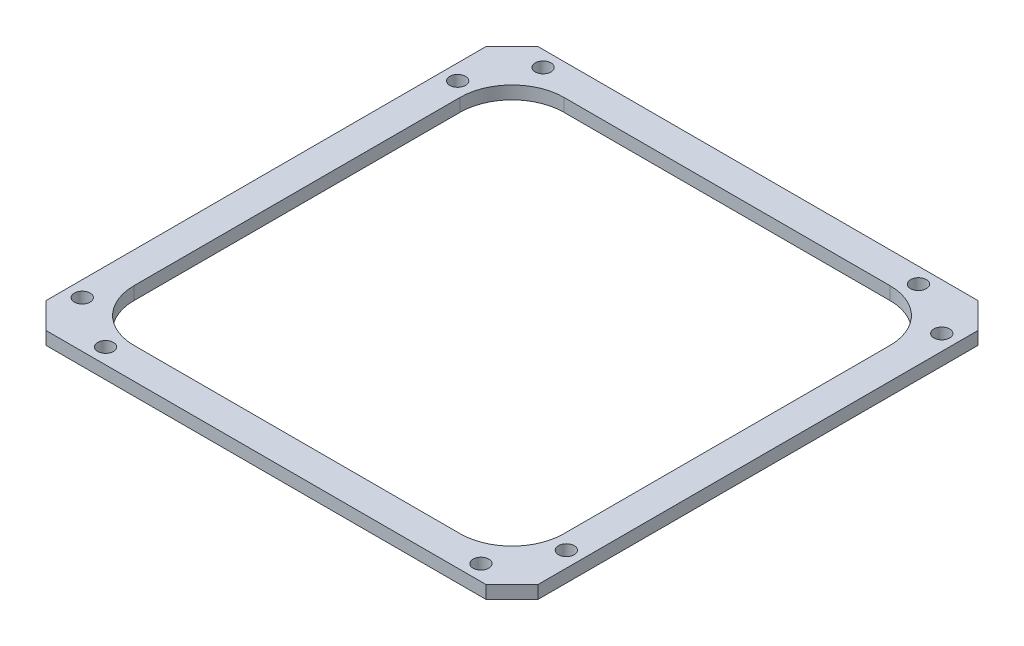
ISO-10303-21;
HEADER;
FILE_DESCRIPTION(('STEP AP214'),'2;1');
FILE_NAME('part.step','',(''),(''),'','','');
FILE_SCHEMA(('AUTOMOTIVE_DESIGN { 1 0 10303 214 1 1 1 1 }'));
ENDSEC;
DATA;
#1=APPLICATION_CONTEXT('core data for automotive mechanical design processes');
#2=APPLICATION_PROTOCOL_DEFINITION('international standard','automotive_design',2000,#1);
#3=PRODUCT_CONTEXT('',#1,'mechanical');
#4=PRODUCT('Part','Part','',(#3));
#5=PRODUCT_RELATED_PRODUCT_CATEGORY('part','',(#4));
#6=PRODUCT_DEFINITION_FORMATION('','',#4);
#7=PRODUCT_DEFINITION_CONTEXT('part definition',#1,'design');
#8=PRODUCT_DEFINITION('design','',#6,#7);
#9=PRODUCT_DEFINITION_SHAPE('','',#8);
#10=(LENGTH_UNIT() NAMED_UNIT(*) SI_UNIT(.MILLI.,.METRE.));
#11=(NAMED_UNIT(*) PLANE_ANGLE_UNIT() SI_UNIT($,.RADIAN.));
#12=(NAMED_UNIT(*) SI_UNIT($,.STERADIAN.) SOLID_ANGLE_UNIT());
#13=UNCERTAINTY_MEASURE_WITH_UNIT(LENGTH_MEASURE(1.E-05),#10,'distance_accuracy_value','');
#14=(GEOMETRIC_REPRESENTATION_CONTEXT(3) GLOBAL_UNCERTAINTY_ASSIGNED_CONTEXT((#13)) GLOBAL_UNIT_ASSIGNED_CONTEXT((#10,
#11,#12)) REPRESENTATION_CONTEXT('',''));
#15=CARTESIAN_POINT('',(0.,0.,0.));
#16=DIRECTION('',(0.,0.,1.));
#17=DIRECTION('',(1.,0.,0.));
#18=AXIS2_PLACEMENT_3D('',#15,#16,#17);
#19=CARTESIAN_POINT('',(-95.,5.,-95.));
#20=DIRECTION('',(0.,0.,-1.));
#21=DIRECTION('',(-1.,0.,0.));
#22=AXIS2_PLACEMENT_3D('',#19,#20,#21);
#23=PLANE('',#22);
#24=DIRECTION('',(1.,0.,0.));
#25=VECTOR('',#24,1.);
#26=CARTESIAN_POINT('',(-95.,5.,-95.));
#27=LINE('',#26,#25);
#28=CARTESIAN_POINT('',(-85.,5.,-95.));
#29=VERTEX_POINT('',#28);
#30=CARTESIAN_POINT('',(85.,5.,-95.));
#31=VERTEX_POINT('',#30);
#32=EDGE_CURVE('E193',#29,#31,#27,.T.);
#33=ORIENTED_EDGE('',*,*,#32,.T.);
#34=DIRECTION('',(0.,-1.,0.));
#35=VECTOR('',#34,1.);
#36=CARTESIAN_POINT('',(85.,5.,-95.));
#37=LINE('',#36,#35);
#38=CARTESIAN_POINT('',(85.,0.,-95.));
#39=VERTEX_POINT('',#38);
#40=EDGE_CURVE('E241',#31,#39,#37,.T.);
#41=ORIENTED_EDGE('',*,*,#40,.T.);
#42=DIRECTION('',(1.,0.,0.));
#43=VECTOR('',#42,1.);
#44=CARTESIAN_POINT('',(-95.,0.,-95.));
#45=LINE('',#44,#43);
#46=CARTESIAN_POINT('',(-85.,0.,-95.));
#47=VERTEX_POINT('',#46);
#48=EDGE_CURVE('E204',#47,#39,#45,.T.);
#49=ORIENTED_EDGE('',*,*,#48,.F.);
#50=DIRECTION('',(0.,1.,0.));
#51=VECTOR('',#50,1.);
#52=CARTESIAN_POINT('',(-85.,5.,-95.));
#53=LINE('',#52,#51);
#54=EDGE_CURVE('E239',#47,#29,#53,.T.);
#55=ORIENTED_EDGE('',*,*,#54,.T.);
#56=EDGE_LOOP('',(#33,#41,#49,#55));
#57=FACE_BOUND('',#56,.T.);
#58=ADVANCED_FACE('F35',(#57),#23,.T.);
#59=CARTESIAN_POINT('',(-95.,5.,-95.));
#60=DIRECTION('',(1.,0.,0.));
#61=DIRECTION('',(0.,0.,-1.));
#62=AXIS2_PLACEMENT_3D('',#59,#60,#61);
#63=PLANE('',#62);
#64=DIRECTION('',(0.,0.,1.));
#65=VECTOR('',#64,1.);
#66=CARTESIAN_POINT('',(-95.,5.,-95.));
#67=LINE('',#66,#65);
#68=CARTESIAN_POINT('',(-95.,5.,-85.));
#69=VERTEX_POINT('',#68);
#70=CARTESIAN_POINT('',(-95.,5.,85.));
#71=VERTEX_POINT('',#70);
#72=EDGE_CURVE('E202',#69,#71,#67,.T.);
#73=ORIENTED_EDGE('',*,*,#72,.F.);
#74=DIRECTION('',(0.,-1.,0.));
#75=VECTOR('',#74,1.);
#76=CARTESIAN_POINT('',(-95.,0.,-85.));
#77=LINE('',#76,#75);
#78=CARTESIAN_POINT('',(-95.,0.,-85.));
#79=VERTEX_POINT('',#78);
#80=EDGE_CURVE('E266',#69,#79,#77,.T.);
#81=ORIENTED_EDGE('',*,*,#80,.T.);
#82=DIRECTION('',(0.,0.,1.));
#83=VECTOR('',#82,1.);
#84=CARTESIAN_POINT('',(-95.,0.,-95.));
#85=LINE('',#84,#83);
#86=CARTESIAN_POINT('',(-95.,0.,85.));
#87=VERTEX_POINT('',#86);
#88=EDGE_CURVE('E197',#79,#87,#85,.T.);
#89=ORIENTED_EDGE('',*,*,#88,.T.);
#90=DIRECTION('',(0.,1.,0.));
#91=VECTOR('',#90,1.);
#92=CARTESIAN_POINT('',(-95.,5.,85.));
#93=LINE('',#92,#91);
#94=EDGE_CURVE('E264',#87,#71,#93,.T.);
#95=ORIENTED_EDGE('',*,*,#94,.T.);
#96=EDGE_LOOP('',(#73,#81,#89,#95));
#97=FACE_BOUND('',#96,.T.);
#98=ADVANCED_FACE('F272',(#97),#63,.F.);
#99=CARTESIAN_POINT('',(-95.,5.,95.));
#100=DIRECTION('',(0.,0.,-1.));
#101=DIRECTION('',(-1.,0.,0.));
#102=AXIS2_PLACEMENT_3D('',#99,#100,#101);
#103=PLANE('',#102);
#104=DIRECTION('',(1.,0.,0.));
#105=VECTOR('',#104,1.);
#106=CARTESIAN_POINT('',(-95.,5.,95.));
#107=LINE('',#106,#105);
#108=CARTESIAN_POINT('',(-85.,5.,95.));
#109=VERTEX_POINT('',#108);
#110=CARTESIAN_POINT('',(85.,5.,95.));
#111=VERTEX_POINT('',#110);
#112=EDGE_CURVE('E200',#109,#111,#107,.T.);
#113=ORIENTED_EDGE('',*,*,#112,.F.);
#114=DIRECTION('',(0.,-1.,0.));
#115=VECTOR('',#114,1.);
#116=CARTESIAN_POINT('',(-85.,5.,95.));
#117=LINE('',#116,#115);
#118=CARTESIAN_POINT('',(-85.,0.,95.));
#119=VERTEX_POINT('',#118);
#120=EDGE_CURVE('E11',#109,#119,#117,.T.);
#121=ORIENTED_EDGE('',*,*,#120,.T.);
#122=DIRECTION('',(1.,0.,0.));
#123=VECTOR('',#122,1.);
#124=CARTESIAN_POINT('',(-95.,0.,95.));
#125=LINE('',#124,#123);
#126=CARTESIAN_POINT('',(85.,0.,95.));
#127=VERTEX_POINT('',#126);
#128=EDGE_CURVE('E210',#119,#127,#125,.T.);
#129=ORIENTED_EDGE('',*,*,#128,.T.);
#130=DIRECTION('',(0.,1.,0.));
#131=VECTOR('',#130,1.);
#132=CARTESIAN_POINT('',(85.,5.,95.));
#133=LINE('',#132,#131);
#134=EDGE_CURVE('E43',#127,#111,#133,.T.);
#135=ORIENTED_EDGE('',*,*,#134,.T.);
#136=EDGE_LOOP('',(#113,#121,#129,#135));
#137=FACE_BOUND('',#136,.T.);
#138=ADVANCED_FACE('F283',(#137),#103,.F.);
#139=CARTESIAN_POINT('',(95.,5.,-95.));
#140=DIRECTION('',(1.,0.,0.));
#141=DIRECTION('',(0.,0.,-1.));
#142=AXIS2_PLACEMENT_3D('',#139,#140,#141);
#143=PLANE('',#142);
#144=DIRECTION('',(0.,0.,1.));
#145=VECTOR('',#144,1.);
#146=CARTESIAN_POINT('',(95.,0.,-95.));
#147=LINE('',#146,#145);
#148=CARTESIAN_POINT('',(95.,0.,-85.));
#149=VERTEX_POINT('',#148);
#150=CARTESIAN_POINT('',(95.,0.,85.));
#151=VERTEX_POINT('',#150);
#152=EDGE_CURVE('E207',#149,#151,#147,.T.);
#153=ORIENTED_EDGE('',*,*,#152,.F.);
#154=DIRECTION('',(0.,1.,0.));
#155=VECTOR('',#154,1.);
#156=CARTESIAN_POINT('',(95.,5.,-85.));
#157=LINE('',#156,#155);
#158=CARTESIAN_POINT('',(95.,5.,-85.));
#159=VERTEX_POINT('',#158);
#160=EDGE_CURVE('E255',#149,#159,#157,.T.);
#161=ORIENTED_EDGE('',*,*,#160,.T.);
#162=DIRECTION('',(0.,0.,1.));
#163=VECTOR('',#162,1.);
#164=CARTESIAN_POINT('',(95.,5.,-95.));
#165=LINE('',#164,#163);
#166=CARTESIAN_POINT('',(95.,5.,85.));
#167=VERTEX_POINT('',#166);
#168=EDGE_CURVE('E196',#159,#167,#165,.T.);
#169=ORIENTED_EDGE('',*,*,#168,.T.);
#170=DIRECTION('',(0.,-1.,0.));
#171=VECTOR('',#170,1.);
#172=CARTESIAN_POINT('',(95.,0.,85.));
#173=LINE('',#172,#171);
#174=EDGE_CURVE('E252',#167,#151,#173,.T.);
#175=ORIENTED_EDGE('',*,*,#174,.T.);
#176=EDGE_LOOP('',(#153,#161,#169,#175));
#177=FACE_BOUND('',#176,.T.);
#178=ADVANCED_FACE('F290',(#177),#143,.T.);
#179=CARTESIAN_POINT('',(0.,5.,0.));
#180=DIRECTION('',(0.,-1.,0.));
#181=DIRECTION('',(0.,0.,-1.));
#182=AXIS2_PLACEMENT_3D('',#179,#180,#181);
#183=PLANE('',#182);
#184=CARTESIAN_POINT('',(77.0000000000146,5.,88.9999999999822));
#185=DIRECTION('',(0.,1.,0.));
#186=DIRECTION('',(0.,0.,1.));
#187=AXIS2_PLACEMENT_3D('',#184,#185,#186);
#188=CIRCLE('',#187,3.04999999999999);
#189=CARTESIAN_POINT('',(77.0000000000146,5.,92.0499999999822));
#190=VERTEX_POINT('',#189);
#191=EDGE_CURVE('E368',#190,#190,#188,.T.);
#192=ORIENTED_EDGE('',*,*,#191,.F.);
#193=EDGE_LOOP('',(#192));
#194=FACE_BOUND('',#193,.T.);
#195=CARTESIAN_POINT('',(67.9999999999984,5.,-89.0000000000162));
#196=DIRECTION('',(0.,1.,0.));
#197=DIRECTION('',(0.,0.,1.));
#198=AXIS2_PLACEMENT_3D('',#195,#196,#197);
#199=CIRCLE('',#198,3.04999999999999);
#200=CARTESIAN_POINT('',(67.9999999999984,5.,-85.9500000000162));
#201=VERTEX_POINT('',#200);
#202=EDGE_CURVE('E375',#201,#201,#199,.T.);
#203=ORIENTED_EDGE('',*,*,#202,.F.);
#204=EDGE_LOOP('',(#203));
#205=FACE_BOUND('',#204,.T.);
#206=CARTESIAN_POINT('',(88.9999999999984,5.,-77.0000000000162));
#207=DIRECTION('',(0.,1.,0.));
#208=DIRECTION('',(0.,0.,1.));
#209=AXIS2_PLACEMENT_3D('',#206,#207,#208);
#210=CIRCLE('',#209,3.04999999999999);
#211=CARTESIAN_POINT('',(88.9999999999984,5.,-73.9500000000162));
#212=VERTEX_POINT('',#211);
#213=EDGE_CURVE('E356',#212,#212,#210,.T.);
#214=ORIENTED_EDGE('',*,*,#213,.F.);
#215=EDGE_LOOP('',(#214));
#216=FACE_BOUND('',#215,.T.);
#217=CARTESIAN_POINT('',(-89.,5.,-68.));
#218=DIRECTION('',(0.,1.,0.));
#219=DIRECTION('',(0.,0.,1.));
#220=AXIS2_PLACEMENT_3D('',#217,#218,#219);
#221=CIRCLE('',#220,3.04999999999999);
#222=CARTESIAN_POINT('',(-89.,5.,-64.95));
#223=VERTEX_POINT('',#222);
#224=EDGE_CURVE('E363',#223,#223,#221,.T.);
#225=ORIENTED_EDGE('',*,*,#224,.F.);
#226=EDGE_LOOP('',(#225));
#227=FACE_BOUND('',#226,.T.);
#228=CARTESIAN_POINT('',(89.0000000000146,5.,67.9999999999822));
#229=DIRECTION('',(0.,1.,0.));
#230=DIRECTION('',(0.,0.,1.));
#231=AXIS2_PLACEMENT_3D('',#228,#229,#230);
#232=CIRCLE('',#231,3.04999999999999);
#233=CARTESIAN_POINT('',(89.0000000000146,5.,71.0499999999822));
#234=VERTEX_POINT('',#233);
#235=EDGE_CURVE('E392',#234,#234,#232,.T.);
#236=ORIENTED_EDGE('',*,*,#235,.F.);
#237=EDGE_LOOP('',(#236));
#238=FACE_BOUND('',#237,.T.);
#239=CARTESIAN_POINT('',(-88.9999999999838,5.,76.9999999999984));
#240=DIRECTION('',(0.,1.,0.));
#241=DIRECTION('',(0.,0.,1.));
#242=AXIS2_PLACEMENT_3D('',#239,#240,#241);
#243=CIRCLE('',#242,3.04999999999999);
#244=CARTESIAN_POINT('',(-88.9999999999838,5.,80.0499999999984));
#245=VERTEX_POINT('',#244);
#246=EDGE_CURVE('E386',#245,#245,#243,.T.);
#247=ORIENTED_EDGE('',*,*,#246,.F.);
#248=EDGE_LOOP('',(#247));
#249=FACE_BOUND('',#248,.T.);
#250=CARTESIAN_POINT('',(-67.9999999999838,5.,88.9999999999984));
#251=DIRECTION('',(0.,1.,0.));
#252=DIRECTION('',(0.,0.,1.));
#253=AXIS2_PLACEMENT_3D('',#250,#251,#252);
#254=CIRCLE('',#253,3.04999999999999);
#255=CARTESIAN_POINT('',(-67.9999999999838,5.,92.0499999999984));
#256=VERTEX_POINT('',#255);
#257=EDGE_CURVE('E380',#256,#256,#254,.T.);
#258=ORIENTED_EDGE('',*,*,#257,.F.);
#259=EDGE_LOOP('',(#258));
#260=FACE_BOUND('',#259,.T.);
#261=CARTESIAN_POINT('',(-77.,5.,-89.));
#262=DIRECTION('',(0.,1.,0.));
#263=DIRECTION('',(0.,0.,1.));
#264=AXIS2_PLACEMENT_3D('',#261,#262,#263);
#265=CIRCLE('',#264,3.04999999999999);
#266=CARTESIAN_POINT('',(-77.,5.,-85.95));
#267=VERTEX_POINT('',#266);
#268=EDGE_CURVE('E183',#267,#267,#265,.T.);
#269=ORIENTED_EDGE('',*,*,#268,.F.);
#270=EDGE_LOOP('',(#269));
#271=FACE_BOUND('',#270,.T.);
#272=DIRECTION('',(-1.,0.,0.));
#273=VECTOR('',#272,1.);
#274=CARTESIAN_POINT('',(-83.,5.,-83.));
#275=LINE('',#274,#273);
#276=CARTESIAN_POINT('',(62.9999999999999,5.,-83.));
#277=VERTEX_POINT('',#276);
#278=CARTESIAN_POINT('',(-63.,5.,-83.));
#279=VERTEX_POINT('',#278);
#280=EDGE_CURVE('E176',#277,#279,#275,.T.);
#281=ORIENTED_EDGE('',*,*,#280,.F.);
#282=CARTESIAN_POINT('',(63.,5.,-63.));
#283=DIRECTION('',(0.,-1.,0.));
#284=DIRECTION('',(0.,0.,-1.));
#285=AXIS2_PLACEMENT_3D('',#282,#283,#284);
#286=CIRCLE('',#285,20.);
#287=CARTESIAN_POINT('',(83.,5.,-63.));
#288=VERTEX_POINT('',#287);
#289=EDGE_CURVE('E175',#277,#288,#286,.T.);
#290=ORIENTED_EDGE('',*,*,#289,.T.);
#291=DIRECTION('',(0.,0.,-1.));
#292=VECTOR('',#291,1.);
#293=CARTESIAN_POINT('',(83.,5.,-83.));
#294=LINE('',#293,#292);
#295=CARTESIAN_POINT('',(83.,5.,63.));
#296=VERTEX_POINT('',#295);
#297=EDGE_CURVE('E166',#296,#288,#294,.T.);
#298=ORIENTED_EDGE('',*,*,#297,.F.);
#299=CARTESIAN_POINT('',(63.,5.,63.));
#300=DIRECTION('',(0.,-1.,0.));
#301=DIRECTION('',(0.,0.,-1.));
#302=AXIS2_PLACEMENT_3D('',#299,#300,#301);
#303=CIRCLE('',#302,20.);
#304=CARTESIAN_POINT('',(62.9999999999999,5.,83.));
#305=VERTEX_POINT('',#304);
#306=EDGE_CURVE('E149',#296,#305,#303,.T.);
#307=ORIENTED_EDGE('',*,*,#306,.T.);
#308=DIRECTION('',(1.,0.,0.));
#309=VECTOR('',#308,1.);
#310=CARTESIAN_POINT('',(-83.,5.,83.));
#311=LINE('',#310,#309);
#312=CARTESIAN_POINT('',(-63.,5.,83.));
#313=VERTEX_POINT('',#312);
#314=EDGE_CURVE('E191',#313,#305,#311,.T.);
#315=ORIENTED_EDGE('',*,*,#314,.F.);
#316=CARTESIAN_POINT('',(-63.,5.,63.));
#317=DIRECTION('',(0.,-1.,0.));
#318=DIRECTION('',(0.,0.,-1.));
#319=AXIS2_PLACEMENT_3D('',#316,#317,#318);
#320=CIRCLE('',#319,20.);
#321=CARTESIAN_POINT('',(-83.,5.,63.));
#322=VERTEX_POINT('',#321);
#323=EDGE_CURVE('E228',#313,#322,#320,.T.);
#324=ORIENTED_EDGE('',*,*,#323,.T.);
#325=DIRECTION('',(0.,0.,1.));
#326=VECTOR('',#325,1.);
#327=CARTESIAN_POINT('',(-83.,5.,-83.));
#328=LINE('',#327,#326);
#329=CARTESIAN_POINT('',(-83.,5.,-63.));
#330=VERTEX_POINT('',#329);
#331=EDGE_CURVE('E180',#330,#322,#328,.T.);
#332=ORIENTED_EDGE('',*,*,#331,.F.);
#333=CARTESIAN_POINT('',(-63.,5.,-63.));
#334=DIRECTION('',(0.,-1.,0.));
#335=DIRECTION('',(0.,0.,-1.));
#336=AXIS2_PLACEMENT_3D('',#333,#334,#335);
#337=CIRCLE('',#336,20.);
#338=EDGE_CURVE('E232',#330,#279,#337,.T.);
#339=ORIENTED_EDGE('',*,*,#338,.T.);
#340=EDGE_LOOP('',(#281,#290,#298,#307,#315,#324,#332,#339));
#341=FACE_BOUND('',#340,.T.);
#342=ORIENTED_EDGE('',*,*,#168,.F.);
#343=DIRECTION('',(0.707106781186548,0.,0.707106781186548));
#344=VECTOR('',#343,1.);
#345=CARTESIAN_POINT('',(85.,5.,-95.));
#346=LINE('',#345,#344);
#347=EDGE_CURVE('E262',#159,#31,#346,.F.);
#348=ORIENTED_EDGE('',*,*,#347,.T.);
#349=ORIENTED_EDGE('',*,*,#32,.F.);
#350=DIRECTION('',(-0.70710678118655,0.,0.707106781186546));
#351=VECTOR('',#350,1.);
#352=CARTESIAN_POINT('',(-95.,5.,-85.));
#353=LINE('',#352,#351);
#354=EDGE_CURVE('E260',#29,#69,#353,.T.);
#355=ORIENTED_EDGE('',*,*,#354,.T.);
#356=ORIENTED_EDGE('',*,*,#72,.T.);
#357=DIRECTION('',(-0.707106781186548,0.,-0.707106781186548));
#358=VECTOR('',#357,1.);
#359=CARTESIAN_POINT('',(-85.,5.,95.));
#360=LINE('',#359,#358);
#361=EDGE_CURVE('E56',#71,#109,#360,.F.);
#362=ORIENTED_EDGE('',*,*,#361,.T.);
#363=ORIENTED_EDGE('',*,*,#112,.T.);
#364=DIRECTION('',(0.70710678118655,0.,-0.707106781186545));
#365=VECTOR('',#364,1.);
#366=CARTESIAN_POINT('',(95.,5.,85.));
#367=LINE('',#366,#365);
#368=EDGE_CURVE('E257',#111,#167,#367,.T.);
#369=ORIENTED_EDGE('',*,*,#368,.T.);
#370=EDGE_LOOP('',(#342,#348,#349,#355,#356,#362,#363,#369));
#371=FACE_BOUND('',#370,.T.);
#372=ADVANCED_FACE('F174',(#194,#205,#216,#227,#238,#249,#260,#271,#341,#371),#183,.F.);
#373=CARTESIAN_POINT('',(0.,0.,0.));
#374=DIRECTION('',(0.,-1.,0.));
#375=DIRECTION('',(0.,0.,-1.));
#376=AXIS2_PLACEMENT_3D('',#373,#374,#375);
#377=PLANE('',#376);
#378=CARTESIAN_POINT('',(77.0000000000146,0.,88.9999999999822));
#379=DIRECTION('',(0.,1.,0.));
#380=DIRECTION('',(0.,0.,1.));
#381=AXIS2_PLACEMENT_3D('',#378,#379,#380);
#382=CIRCLE('',#381,3.04999999999999);
#383=CARTESIAN_POINT('',(77.0000000000146,0.,92.0499999999822));
#384=VERTEX_POINT('',#383);
#385=EDGE_CURVE('E371',#384,#384,#382,.T.);
#386=ORIENTED_EDGE('',*,*,#385,.T.);
#387=EDGE_LOOP('',(#386));
#388=FACE_BOUND('',#387,.T.);
#389=CARTESIAN_POINT('',(67.9999999999984,0.,-89.0000000000162));
#390=DIRECTION('',(0.,1.,0.));
#391=DIRECTION('',(0.,0.,1.));
#392=AXIS2_PLACEMENT_3D('',#389,#390,#391);
#393=CIRCLE('',#392,3.04999999999999);
#394=CARTESIAN_POINT('',(67.9999999999984,0.,-85.9500000000162));
#395=VERTEX_POINT('',#394);
#396=EDGE_CURVE('E360',#395,#395,#393,.T.);
#397=ORIENTED_EDGE('',*,*,#396,.T.);
#398=EDGE_LOOP('',(#397));
#399=FACE_BOUND('',#398,.T.);
#400=CARTESIAN_POINT('',(88.9999999999984,0.,-77.0000000000162));
#401=DIRECTION('',(0.,1.,0.));
#402=DIRECTION('',(0.,0.,1.));
#403=AXIS2_PLACEMENT_3D('',#400,#401,#402);
#404=CIRCLE('',#403,3.04999999999999);
#405=CARTESIAN_POINT('',(88.9999999999984,0.,-73.9500000000162));
#406=VERTEX_POINT('',#405);
#407=EDGE_CURVE('E359',#406,#406,#404,.T.);
#408=ORIENTED_EDGE('',*,*,#407,.T.);
#409=EDGE_LOOP('',(#408));
#410=FACE_BOUND('',#409,.T.);
#411=CARTESIAN_POINT('',(-89.,0.,-68.));
#412=DIRECTION('',(0.,1.,0.));
#413=DIRECTION('',(0.,0.,1.));
#414=AXIS2_PLACEMENT_3D('',#411,#412,#413);
#415=CIRCLE('',#414,3.04999999999999);
#416=CARTESIAN_POINT('',(-89.,0.,-64.95));
#417=VERTEX_POINT('',#416);
#418=EDGE_CURVE('E354',#417,#417,#415,.T.);
#419=ORIENTED_EDGE('',*,*,#418,.T.);
#420=EDGE_LOOP('',(#419));
#421=FACE_BOUND('',#420,.T.);
#422=CARTESIAN_POINT('',(89.0000000000146,0.,67.9999999999822));
#423=DIRECTION('',(0.,1.,0.));
#424=DIRECTION('',(0.,0.,1.));
#425=AXIS2_PLACEMENT_3D('',#422,#423,#424);
#426=CIRCLE('',#425,3.04999999999999);
#427=CARTESIAN_POINT('',(89.0000000000146,0.,71.0499999999822));
#428=VERTEX_POINT('',#427);
#429=EDGE_CURVE('E372',#428,#428,#426,.T.);
#430=ORIENTED_EDGE('',*,*,#429,.T.);
#431=EDGE_LOOP('',(#430));
#432=FACE_BOUND('',#431,.T.);
#433=CARTESIAN_POINT('',(-88.9999999999838,0.,76.9999999999984));
#434=DIRECTION('',(0.,1.,0.));
#435=DIRECTION('',(0.,0.,1.));
#436=AXIS2_PLACEMENT_3D('',#433,#434,#435);
#437=CIRCLE('',#436,3.04999999999999);
#438=CARTESIAN_POINT('',(-88.9999999999838,0.,80.0499999999984));
#439=VERTEX_POINT('',#438);
#440=EDGE_CURVE('E389',#439,#439,#437,.T.);
#441=ORIENTED_EDGE('',*,*,#440,.T.);
#442=EDGE_LOOP('',(#441));
#443=FACE_BOUND('',#442,.T.);
#444=CARTESIAN_POINT('',(-67.9999999999838,0.,88.9999999999984));
#445=DIRECTION('',(0.,1.,0.));
#446=DIRECTION('',(0.,0.,1.));
#447=AXIS2_PLACEMENT_3D('',#444,#445,#446);
#448=CIRCLE('',#447,3.04999999999999);
#449=CARTESIAN_POINT('',(-67.9999999999838,0.,92.0499999999984));
#450=VERTEX_POINT('',#449);
#451=EDGE_CURVE('E383',#450,#450,#448,.T.);
#452=ORIENTED_EDGE('',*,*,#451,.T.);
#453=EDGE_LOOP('',(#452));
#454=FACE_BOUND('',#453,.T.);
#455=CARTESIAN_POINT('',(-77.,0.,-89.));
#456=DIRECTION('',(0.,1.,0.));
#457=DIRECTION('',(0.,0.,1.));
#458=AXIS2_PLACEMENT_3D('',#455,#456,#457);
#459=CIRCLE('',#458,3.04999999999999);
#460=CARTESIAN_POINT('',(-77.,0.,-85.95));
#461=VERTEX_POINT('',#460);
#462=EDGE_CURVE('E177',#461,#461,#459,.T.);
#463=ORIENTED_EDGE('',*,*,#462,.T.);
#464=EDGE_LOOP('',(#463));
#465=FACE_BOUND('',#464,.T.);
#466=DIRECTION('',(1.,0.,0.));
#467=VECTOR('',#466,1.);
#468=CARTESIAN_POINT('',(-83.,0.,83.));
#469=LINE('',#468,#467);
#470=CARTESIAN_POINT('',(-63.,0.,83.));
#471=VERTEX_POINT('',#470);
#472=CARTESIAN_POINT('',(62.9999999999999,0.,83.));
#473=VERTEX_POINT('',#472);
#474=EDGE_CURVE('E186',#471,#473,#469,.T.);
#475=ORIENTED_EDGE('',*,*,#474,.T.);
#476=CARTESIAN_POINT('',(63.,0.,63.));
#477=DIRECTION('',(0.,-1.,0.));
#478=DIRECTION('',(0.,0.,-1.));
#479=AXIS2_PLACEMENT_3D('',#476,#477,#478);
#480=CIRCLE('',#479,20.);
#481=CARTESIAN_POINT('',(83.,0.,63.));
#482=VERTEX_POINT('',#481);
#483=EDGE_CURVE('E159',#473,#482,#480,.F.);
#484=ORIENTED_EDGE('',*,*,#483,.T.);
#485=DIRECTION('',(0.,0.,-1.));
#486=VECTOR('',#485,1.);
#487=CARTESIAN_POINT('',(83.,0.,-83.));
#488=LINE('',#487,#486);
#489=CARTESIAN_POINT('',(83.,0.,-63.));
#490=VERTEX_POINT('',#489);
#491=EDGE_CURVE('E169',#482,#490,#488,.T.);
#492=ORIENTED_EDGE('',*,*,#491,.T.);
#493=CARTESIAN_POINT('',(63.,0.,-63.));
#494=DIRECTION('',(0.,-1.,0.));
#495=DIRECTION('',(0.,0.,-1.));
#496=AXIS2_PLACEMENT_3D('',#493,#494,#495);
#497=CIRCLE('',#496,20.);
#498=CARTESIAN_POINT('',(62.9999999999999,0.,-83.));
#499=VERTEX_POINT('',#498);
#500=EDGE_CURVE('E237',#490,#499,#497,.F.);
#501=ORIENTED_EDGE('',*,*,#500,.T.);
#502=DIRECTION('',(-1.,0.,0.));
#503=VECTOR('',#502,1.);
#504=CARTESIAN_POINT('',(-83.,0.,-83.));
#505=LINE('',#504,#503);
#506=CARTESIAN_POINT('',(-63.,0.,-83.));
#507=VERTEX_POINT('',#506);
#508=EDGE_CURVE('E344',#499,#507,#505,.T.);
#509=ORIENTED_EDGE('',*,*,#508,.T.);
#510=CARTESIAN_POINT('',(-63.,0.,-63.));
#511=DIRECTION('',(0.,-1.,0.));
#512=DIRECTION('',(0.,0.,-1.));
#513=AXIS2_PLACEMENT_3D('',#510,#511,#512);
#514=CIRCLE('',#513,20.);
#515=CARTESIAN_POINT('',(-83.,0.,-63.));
#516=VERTEX_POINT('',#515);
#517=EDGE_CURVE('E234',#507,#516,#514,.F.);
#518=ORIENTED_EDGE('',*,*,#517,.T.);
#519=DIRECTION('',(0.,0.,1.));
#520=VECTOR('',#519,1.);
#521=CARTESIAN_POINT('',(-83.,0.,-83.));
#522=LINE('',#521,#520);
#523=CARTESIAN_POINT('',(-83.,0.,63.));
#524=VERTEX_POINT('',#523);
#525=EDGE_CURVE('E348',#516,#524,#522,.T.);
#526=ORIENTED_EDGE('',*,*,#525,.T.);
#527=CARTESIAN_POINT('',(-63.,0.,63.));
#528=DIRECTION('',(0.,-1.,0.));
#529=DIRECTION('',(0.,0.,-1.));
#530=AXIS2_PLACEMENT_3D('',#527,#528,#529);
#531=CIRCLE('',#530,20.);
#532=EDGE_CURVE('E230',#524,#471,#531,.F.);
#533=ORIENTED_EDGE('',*,*,#532,.T.);
#534=EDGE_LOOP('',(#475,#484,#492,#501,#509,#518,#526,#533));
#535=FACE_BOUND('',#534,.T.);
#536=ORIENTED_EDGE('',*,*,#48,.T.);
#537=DIRECTION('',(-0.707106781186548,0.,-0.707106781186548));
#538=VECTOR('',#537,1.);
#539=CARTESIAN_POINT('',(90.,0.,-90.));
#540=LINE('',#539,#538);
#541=EDGE_CURVE('E250',#39,#149,#540,.F.);
#542=ORIENTED_EDGE('',*,*,#541,.T.);
#543=ORIENTED_EDGE('',*,*,#152,.T.);
#544=DIRECTION('',(-0.70710678118655,0.,0.707106781186545));
#545=VECTOR('',#544,1.);
#546=CARTESIAN_POINT('',(89.9999999999997,0.,90.0000000000003));
#547=LINE('',#546,#545);
#548=EDGE_CURVE('E244',#151,#127,#547,.T.);
#549=ORIENTED_EDGE('',*,*,#548,.T.);
#550=ORIENTED_EDGE('',*,*,#128,.F.);
#551=DIRECTION('',(0.707106781186548,0.,0.707106781186548));
#552=VECTOR('',#551,1.);
#553=CARTESIAN_POINT('',(-90.,0.,90.));
#554=LINE('',#553,#552);
#555=EDGE_CURVE('E246',#119,#87,#554,.F.);
#556=ORIENTED_EDGE('',*,*,#555,.T.);
#557=ORIENTED_EDGE('',*,*,#88,.F.);
#558=DIRECTION('',(0.70710678118655,0.,-0.707106781186546));
#559=VECTOR('',#558,1.);
#560=CARTESIAN_POINT('',(-89.9999999999997,0.,-90.0000000000003));
#561=LINE('',#560,#559);
#562=EDGE_CURVE('E248',#79,#47,#561,.T.);
#563=ORIENTED_EDGE('',*,*,#562,.T.);
#564=EDGE_LOOP('',(#536,#542,#543,#549,#550,#556,#557,#563));
#565=FACE_BOUND('',#564,.T.);
#566=ADVANCED_FACE('F277',(#388,#399,#410,#421,#432,#443,#454,#465,#535,#565),#377,.T.);
#567=CARTESIAN_POINT('',(83.,0.,-83.));
#568=DIRECTION('',(1.,0.,0.));
#569=DIRECTION('',(0.,0.,-1.));
#570=AXIS2_PLACEMENT_3D('',#567,#568,#569);
#571=PLANE('',#570);
#572=ORIENTED_EDGE('',*,*,#491,.F.);
#573=DIRECTION('',(0.,1.,0.));
#574=VECTOR('',#573,1.);
#575=CARTESIAN_POINT('',(83.,5.,63.));
#576=LINE('',#575,#574);
#577=EDGE_CURVE('E153',#482,#296,#576,.T.);
#578=ORIENTED_EDGE('',*,*,#577,.T.);
#579=ORIENTED_EDGE('',*,*,#297,.T.);
#580=DIRECTION('',(0.,1.,0.));
#581=VECTOR('',#580,1.);
#582=CARTESIAN_POINT('',(83.,0.,-63.));
#583=LINE('',#582,#581);
#584=EDGE_CURVE('E171',#288,#490,#583,.F.);
#585=ORIENTED_EDGE('',*,*,#584,.T.);
#586=EDGE_LOOP('',(#572,#578,#579,#585));
#587=FACE_BOUND('',#586,.T.);
#588=ADVANCED_FACE('F165',(#587),#571,.F.);
#589=CARTESIAN_POINT('',(-83.,0.,83.));
#590=DIRECTION('',(0.,0.,1.));
#591=DIRECTION('',(1.,0.,0.));
#592=AXIS2_PLACEMENT_3D('',#589,#590,#591);
#593=PLANE('',#592);
#594=ORIENTED_EDGE('',*,*,#314,.T.);
#595=DIRECTION('',(0.,1.,0.));
#596=VECTOR('',#595,1.);
#597=CARTESIAN_POINT('',(63.,0.,83.));
#598=LINE('',#597,#596);
#599=EDGE_CURVE('E154',#305,#473,#598,.F.);
#600=ORIENTED_EDGE('',*,*,#599,.T.);
#601=ORIENTED_EDGE('',*,*,#474,.F.);
#602=DIRECTION('',(0.,1.,0.));
#603=VECTOR('',#602,1.);
#604=CARTESIAN_POINT('',(-63.,5.,83.));
#605=LINE('',#604,#603);
#606=EDGE_CURVE('E170',#471,#313,#605,.T.);
#607=ORIENTED_EDGE('',*,*,#606,.T.);
#608=EDGE_LOOP('',(#594,#600,#601,#607));
#609=FACE_BOUND('',#608,.T.);
#610=ADVANCED_FACE('F443',(#609),#593,.F.);
#611=CARTESIAN_POINT('',(-83.,0.,-83.));
#612=DIRECTION('',(-1.,0.,0.));
#613=DIRECTION('',(0.,0.,1.));
#614=AXIS2_PLACEMENT_3D('',#611,#612,#613);
#615=PLANE('',#614);
#616=ORIENTED_EDGE('',*,*,#331,.T.);
#617=DIRECTION('',(0.,1.,0.));
#618=VECTOR('',#617,1.);
#619=CARTESIAN_POINT('',(-83.,0.,63.));
#620=LINE('',#619,#618);
#621=EDGE_CURVE('E221',#322,#524,#620,.F.);
#622=ORIENTED_EDGE('',*,*,#621,.T.);
#623=ORIENTED_EDGE('',*,*,#525,.F.);
#624=DIRECTION('',(0.,1.,0.));
#625=VECTOR('',#624,1.);
#626=CARTESIAN_POINT('',(-83.,5.,-63.));
#627=LINE('',#626,#625);
#628=EDGE_CURVE('E218',#516,#330,#627,.T.);
#629=ORIENTED_EDGE('',*,*,#628,.T.);
#630=EDGE_LOOP('',(#616,#622,#623,#629));
#631=FACE_BOUND('',#630,.T.);
#632=ADVANCED_FACE('F446',(#631),#615,.F.);
#633=CARTESIAN_POINT('',(-83.,0.,-83.));
#634=DIRECTION('',(0.,0.,-1.));
#635=DIRECTION('',(-1.,0.,0.));
#636=AXIS2_PLACEMENT_3D('',#633,#634,#635);
#637=PLANE('',#636);
#638=ORIENTED_EDGE('',*,*,#280,.T.);
#639=DIRECTION('',(0.,1.,0.));
#640=VECTOR('',#639,1.);
#641=CARTESIAN_POINT('',(-63.,0.,-83.));
#642=LINE('',#641,#640);
#643=EDGE_CURVE('E160',#279,#507,#642,.F.);
#644=ORIENTED_EDGE('',*,*,#643,.T.);
#645=ORIENTED_EDGE('',*,*,#508,.F.);
#646=DIRECTION('',(0.,1.,0.));
#647=VECTOR('',#646,1.);
#648=CARTESIAN_POINT('',(63.,5.,-83.));
#649=LINE('',#648,#647);
#650=EDGE_CURVE('E223',#499,#277,#649,.T.);
#651=ORIENTED_EDGE('',*,*,#650,.T.);
#652=EDGE_LOOP('',(#638,#644,#645,#651));
#653=FACE_BOUND('',#652,.T.);
#654=ADVANCED_FACE('F320',(#653),#637,.F.);
#655=CARTESIAN_POINT('',(63.,0.,63.));
#656=DIRECTION('',(0.,-1.,0.));
#657=DIRECTION('',(0.,0.,-1.));
#658=AXIS2_PLACEMENT_3D('',#655,#656,#657);
#659=CYLINDRICAL_SURFACE('',#658,20.);
#660=ORIENTED_EDGE('',*,*,#483,.F.);
#661=ORIENTED_EDGE('',*,*,#599,.F.);
#662=ORIENTED_EDGE('',*,*,#306,.F.);
#663=ORIENTED_EDGE('',*,*,#577,.F.);
#664=EDGE_LOOP('',(#660,#661,#662,#663));
#665=FACE_BOUND('',#664,.T.);
#666=ADVANCED_FACE('F152',(#665),#659,.F.);
#667=CARTESIAN_POINT('',(-63.,0.,63.));
#668=DIRECTION('',(0.,-1.,0.));
#669=DIRECTION('',(0.,0.,-1.));
#670=AXIS2_PLACEMENT_3D('',#667,#668,#669);
#671=CYLINDRICAL_SURFACE('',#670,20.);
#672=ORIENTED_EDGE('',*,*,#532,.F.);
#673=ORIENTED_EDGE('',*,*,#621,.F.);
#674=ORIENTED_EDGE('',*,*,#323,.F.);
#675=ORIENTED_EDGE('',*,*,#606,.F.);
#676=EDGE_LOOP('',(#672,#673,#674,#675));
#677=FACE_BOUND('',#676,.T.);
#678=ADVANCED_FACE('F319',(#677),#671,.F.);
#679=CARTESIAN_POINT('',(-63.,0.,-63.));
#680=DIRECTION('',(0.,-1.,0.));
#681=DIRECTION('',(0.,0.,-1.));
#682=AXIS2_PLACEMENT_3D('',#679,#680,#681);
#683=CYLINDRICAL_SURFACE('',#682,20.);
#684=ORIENTED_EDGE('',*,*,#517,.F.);
#685=ORIENTED_EDGE('',*,*,#643,.F.);
#686=ORIENTED_EDGE('',*,*,#338,.F.);
#687=ORIENTED_EDGE('',*,*,#628,.F.);
#688=EDGE_LOOP('',(#684,#685,#686,#687));
#689=FACE_BOUND('',#688,.T.);
#690=ADVANCED_FACE('F323',(#689),#683,.F.);
#691=CARTESIAN_POINT('',(63.,0.,-63.));
#692=DIRECTION('',(0.,-1.,0.));
#693=DIRECTION('',(0.,0.,-1.));
#694=AXIS2_PLACEMENT_3D('',#691,#692,#693);
#695=CYLINDRICAL_SURFACE('',#694,20.);
#696=ORIENTED_EDGE('',*,*,#500,.F.);
#697=ORIENTED_EDGE('',*,*,#584,.F.);
#698=ORIENTED_EDGE('',*,*,#289,.F.);
#699=ORIENTED_EDGE('',*,*,#650,.F.);
#700=EDGE_LOOP('',(#696,#697,#698,#699));
#701=FACE_BOUND('',#700,.T.);
#702=ADVANCED_FACE('F327',(#701),#695,.F.);
#703=CARTESIAN_POINT('',(-77.,0.,-89.));
#704=DIRECTION('',(0.,1.,0.));
#705=DIRECTION('',(0.,0.,1.));
#706=AXIS2_PLACEMENT_3D('',#703,#704,#705);
#707=CYLINDRICAL_SURFACE('',#706,3.04999999999999);
#708=ORIENTED_EDGE('',*,*,#462,.F.);
#709=EDGE_LOOP('',(#708));
#710=FACE_BOUND('',#709,.T.);
#711=ORIENTED_EDGE('',*,*,#268,.T.);
#712=EDGE_LOOP('',(#711));
#713=FACE_BOUND('',#712,.T.);
#714=ADVANCED_FACE('F330',(#710,#713),#707,.F.);
#715=CARTESIAN_POINT('',(-67.9999999999838,0.,88.9999999999984));
#716=DIRECTION('',(0.,1.,0.));
#717=DIRECTION('',(0.,0.,1.));
#718=AXIS2_PLACEMENT_3D('',#715,#716,#717);
#719=CYLINDRICAL_SURFACE('',#718,3.04999999999999);
#720=ORIENTED_EDGE('',*,*,#451,.F.);
#721=EDGE_LOOP('',(#720));
#722=FACE_BOUND('',#721,.T.);
#723=ORIENTED_EDGE('',*,*,#257,.T.);
#724=EDGE_LOOP('',(#723));
#725=FACE_BOUND('',#724,.T.);
#726=ADVANCED_FACE('F335',(#722,#725),#719,.F.);
#727=CARTESIAN_POINT('',(-88.9999999999838,0.,76.9999999999984));
#728=DIRECTION('',(0.,1.,0.));
#729=DIRECTION('',(0.,0.,1.));
#730=AXIS2_PLACEMENT_3D('',#727,#728,#729);
#731=CYLINDRICAL_SURFACE('',#730,3.04999999999999);
#732=ORIENTED_EDGE('',*,*,#440,.F.);
#733=EDGE_LOOP('',(#732));
#734=FACE_BOUND('',#733,.T.);
#735=ORIENTED_EDGE('',*,*,#246,.T.);
#736=EDGE_LOOP('',(#735));
#737=FACE_BOUND('',#736,.T.);
#738=ADVANCED_FACE('F404',(#734,#737),#731,.F.);
#739=CARTESIAN_POINT('',(89.0000000000146,0.,67.9999999999822));
#740=DIRECTION('',(0.,1.,0.));
#741=DIRECTION('',(0.,0.,1.));
#742=AXIS2_PLACEMENT_3D('',#739,#740,#741);
#743=CYLINDRICAL_SURFACE('',#742,3.04999999999999);
#744=ORIENTED_EDGE('',*,*,#429,.F.);
#745=EDGE_LOOP('',(#744));
#746=FACE_BOUND('',#745,.T.);
#747=ORIENTED_EDGE('',*,*,#235,.T.);
#748=EDGE_LOOP('',(#747));
#749=FACE_BOUND('',#748,.T.);
#750=ADVANCED_FACE('F400',(#746,#749),#743,.F.);
#751=CARTESIAN_POINT('',(-89.,0.,-68.));
#752=DIRECTION('',(0.,1.,0.));
#753=DIRECTION('',(0.,0.,1.));
#754=AXIS2_PLACEMENT_3D('',#751,#752,#753);
#755=CYLINDRICAL_SURFACE('',#754,3.04999999999999);
#756=ORIENTED_EDGE('',*,*,#418,.F.);
#757=EDGE_LOOP('',(#756));
#758=FACE_BOUND('',#757,.T.);
#759=ORIENTED_EDGE('',*,*,#224,.T.);
#760=EDGE_LOOP('',(#759));
#761=FACE_BOUND('',#760,.T.);
#762=ADVANCED_FACE('F403',(#758,#761),#755,.F.);
#763=CARTESIAN_POINT('',(88.9999999999984,0.,-77.0000000000162));
#764=DIRECTION('',(0.,1.,0.));
#765=DIRECTION('',(0.,0.,1.));
#766=AXIS2_PLACEMENT_3D('',#763,#764,#765);
#767=CYLINDRICAL_SURFACE('',#766,3.04999999999999);
#768=ORIENTED_EDGE('',*,*,#407,.F.);
#769=EDGE_LOOP('',(#768));
#770=FACE_BOUND('',#769,.T.);
#771=ORIENTED_EDGE('',*,*,#213,.T.);
#772=EDGE_LOOP('',(#771));
#773=FACE_BOUND('',#772,.T.);
#774=ADVANCED_FACE('F432',(#770,#773),#767,.F.);
#775=CARTESIAN_POINT('',(67.9999999999984,0.,-89.0000000000162));
#776=DIRECTION('',(0.,1.,0.));
#777=DIRECTION('',(0.,0.,1.));
#778=AXIS2_PLACEMENT_3D('',#775,#776,#777);
#779=CYLINDRICAL_SURFACE('',#778,3.04999999999999);
#780=ORIENTED_EDGE('',*,*,#396,.F.);
#781=EDGE_LOOP('',(#780));
#782=FACE_BOUND('',#781,.T.);
#783=ORIENTED_EDGE('',*,*,#202,.T.);
#784=EDGE_LOOP('',(#783));
#785=FACE_BOUND('',#784,.T.);
#786=ADVANCED_FACE('F429',(#782,#785),#779,.F.);
#787=CARTESIAN_POINT('',(77.0000000000146,0.,88.9999999999822));
#788=DIRECTION('',(0.,1.,0.));
#789=DIRECTION('',(0.,0.,1.));
#790=AXIS2_PLACEMENT_3D('',#787,#788,#789);
#791=CYLINDRICAL_SURFACE('',#790,3.04999999999999);
#792=ORIENTED_EDGE('',*,*,#385,.F.);
#793=EDGE_LOOP('',(#792));
#794=FACE_BOUND('',#793,.T.);
#795=ORIENTED_EDGE('',*,*,#191,.T.);
#796=EDGE_LOOP('',(#795));
#797=FACE_BOUND('',#796,.T.);
#798=ADVANCED_FACE('F306',(#794,#797),#791,.F.);
#799=CARTESIAN_POINT('',(85.,5.,-95.));
#800=DIRECTION('',(-0.707106781186547,0.,0.707106781186547));
#801=DIRECTION('',(0.,-1.,0.));
#802=AXIS2_PLACEMENT_3D('',#799,#800,#801);
#803=PLANE('',#802);
#804=ORIENTED_EDGE('',*,*,#347,.F.);
#805=ORIENTED_EDGE('',*,*,#160,.F.);
#806=ORIENTED_EDGE('',*,*,#541,.F.);
#807=ORIENTED_EDGE('',*,*,#40,.F.);
#808=EDGE_LOOP('',(#804,#805,#806,#807));
#809=FACE_BOUND('',#808,.T.);
#810=ADVANCED_FACE('F295',(#809),#803,.F.);
#811=CARTESIAN_POINT('',(-95.,5.,-85.));
#812=DIRECTION('',(-0.707106781186545,0.,-0.707106781186549));
#813=DIRECTION('',(0.,1.,0.));
#814=AXIS2_PLACEMENT_3D('',#811,#812,#813);
#815=PLANE('',#814);
#816=ORIENTED_EDGE('',*,*,#354,.F.);
#817=ORIENTED_EDGE('',*,*,#54,.F.);
#818=ORIENTED_EDGE('',*,*,#562,.F.);
#819=ORIENTED_EDGE('',*,*,#80,.F.);
#820=EDGE_LOOP('',(#816,#817,#818,#819));
#821=FACE_BOUND('',#820,.T.);
#822=ADVANCED_FACE('F299',(#821),#815,.T.);
#823=CARTESIAN_POINT('',(-85.,5.,95.));
#824=DIRECTION('',(0.707106781186547,0.,-0.707106781186547));
#825=DIRECTION('',(0.,-1.,0.));
#826=AXIS2_PLACEMENT_3D('',#823,#824,#825);
#827=PLANE('',#826);
#828=ORIENTED_EDGE('',*,*,#361,.F.);
#829=ORIENTED_EDGE('',*,*,#94,.F.);
#830=ORIENTED_EDGE('',*,*,#555,.F.);
#831=ORIENTED_EDGE('',*,*,#120,.F.);
#832=EDGE_LOOP('',(#828,#829,#830,#831));
#833=FACE_BOUND('',#832,.T.);
#834=ADVANCED_FACE('F282',(#833),#827,.F.);
#835=CARTESIAN_POINT('',(95.,5.,85.));
#836=DIRECTION('',(0.707106781186545,0.,0.70710678118655));
#837=DIRECTION('',(0.,1.,0.));
#838=AXIS2_PLACEMENT_3D('',#835,#836,#837);
#839=PLANE('',#838);
#840=ORIENTED_EDGE('',*,*,#368,.F.);
#841=ORIENTED_EDGE('',*,*,#134,.F.);
#842=ORIENTED_EDGE('',*,*,#548,.F.);
#843=ORIENTED_EDGE('',*,*,#174,.F.);
#844=EDGE_LOOP('',(#840,#841,#842,#843));
#845=FACE_BOUND('',#844,.T.);
#846=ADVANCED_FACE('F37',(#845),#839,.T.);
#847=CLOSED_SHELL('',(#58,#98,#138,#178,#372,#566,#588,#610,#632,#654,#666,#678,#690,#702,#714,
#726,#738,#750,#762,#774,#786,#798,#810,#822,#834,#846));
#848=MANIFOLD_SOLID_BREP('B2',#847);
#849=ADVANCED_BREP_SHAPE_REPRESENTATION('',(#18,#848),#14);
#850=SHAPE_DEFINITION_REPRESENTATION(#9,#849);
ENDSEC;
END-ISO-10303-21;
